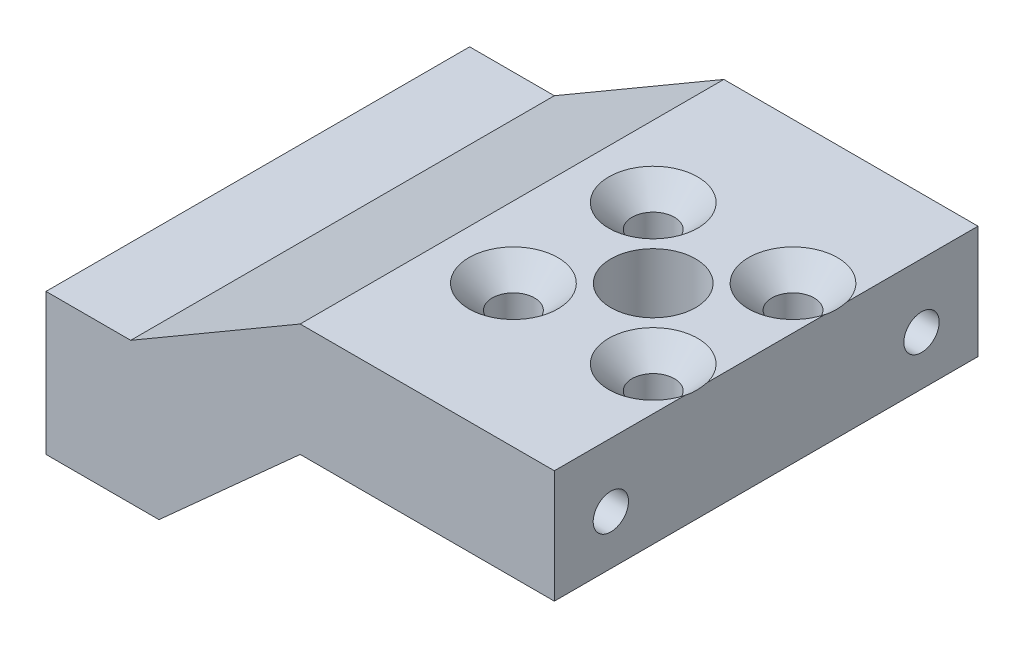
ISO-10303-21;
HEADER;
FILE_DESCRIPTION(('STEP AP214'),'2;1');
FILE_NAME('part.step','',(''),(''),'','','');
FILE_SCHEMA(('AUTOMOTIVE_DESIGN { 1 0 10303 214 1 1 1 1 }'));
ENDSEC;
DATA;
#1=APPLICATION_CONTEXT('core data for automotive mechanical design processes');
#2=APPLICATION_PROTOCOL_DEFINITION('international standard','automotive_design',2000,#1);
#3=PRODUCT_CONTEXT('',#1,'mechanical');
#4=PRODUCT('Part','Part','',(#3));
#5=PRODUCT_RELATED_PRODUCT_CATEGORY('part','',(#4));
#6=PRODUCT_DEFINITION_FORMATION('','',#4);
#7=PRODUCT_DEFINITION_CONTEXT('part definition',#1,'design');
#8=PRODUCT_DEFINITION('design','',#6,#7);
#9=PRODUCT_DEFINITION_SHAPE('','',#8);
#10=(LENGTH_UNIT() NAMED_UNIT(*) SI_UNIT(.MILLI.,.METRE.));
#11=(NAMED_UNIT(*) PLANE_ANGLE_UNIT() SI_UNIT($,.RADIAN.));
#12=(NAMED_UNIT(*) SI_UNIT($,.STERADIAN.) SOLID_ANGLE_UNIT());
#13=UNCERTAINTY_MEASURE_WITH_UNIT(LENGTH_MEASURE(1.E-05),#10,'distance_accuracy_value','');
#14=(GEOMETRIC_REPRESENTATION_CONTEXT(3) GLOBAL_UNCERTAINTY_ASSIGNED_CONTEXT((#13)) GLOBAL_UNIT_ASSIGNED_CONTEXT((#10,
#11,#12)) REPRESENTATION_CONTEXT('',''));
#15=CARTESIAN_POINT('',(0.,0.,0.));
#16=DIRECTION('',(0.,0.,1.));
#17=DIRECTION('',(1.,0.,0.));
#18=AXIS2_PLACEMENT_3D('',#15,#16,#17);
#19=CARTESIAN_POINT('',(0.,10.,0.));
#20=DIRECTION('',(0.,0.,-1.));
#21=DIRECTION('',(-1.,0.,0.));
#22=AXIS2_PLACEMENT_3D('',#19,#20,#21);
#23=PLANE('',#22);
#24=DIRECTION('',(-1.,0.,0.));
#25=VECTOR('',#24,1.);
#26=CARTESIAN_POINT('',(41.,9.,0.));
#27=LINE('',#26,#25);
#28=CARTESIAN_POINT('',(39.,9.,0.));
#29=VERTEX_POINT('',#28);
#30=CARTESIAN_POINT('',(21.,9.,0.));
#31=VERTEX_POINT('',#30);
#32=EDGE_CURVE('E143',#29,#31,#27,.T.);
#33=ORIENTED_EDGE('',*,*,#32,.F.);
#34=DIRECTION('',(0.,-1.,0.));
#35=VECTOR('',#34,1.);
#36=CARTESIAN_POINT('',(39.,17.,0.));
#37=LINE('',#36,#35);
#38=CARTESIAN_POINT('',(39.,17.,0.));
#39=VERTEX_POINT('',#38);
#40=EDGE_CURVE('E131',#39,#29,#37,.T.);
#41=ORIENTED_EDGE('',*,*,#40,.F.);
#42=DIRECTION('',(1.,0.,0.));
#43=VECTOR('',#42,1.);
#44=CARTESIAN_POINT('',(39.,17.,0.));
#45=LINE('',#44,#43);
#46=CARTESIAN_POINT('',(21.,17.,0.));
#47=VERTEX_POINT('',#46);
#48=EDGE_CURVE('E151',#47,#39,#45,.T.);
#49=ORIENTED_EDGE('',*,*,#48,.F.);
#50=DIRECTION('',(0.863778900898433,0.503871025524086,0.));
#51=VECTOR('',#50,1.);
#52=CARTESIAN_POINT('',(21.,17.,0.));
#53=LINE('',#52,#51);
#54=CARTESIAN_POINT('',(9.,10.,0.));
#55=VERTEX_POINT('',#54);
#56=EDGE_CURVE('E148',#55,#47,#53,.T.);
#57=ORIENTED_EDGE('',*,*,#56,.F.);
#58=DIRECTION('',(1.,0.,0.));
#59=VECTOR('',#58,1.);
#60=CARTESIAN_POINT('',(0.,10.,0.));
#61=LINE('',#60,#59);
#62=CARTESIAN_POINT('',(3.,10.,0.));
#63=VERTEX_POINT('',#62);
#64=EDGE_CURVE('E189',#63,#55,#61,.T.);
#65=ORIENTED_EDGE('',*,*,#64,.F.);
#66=DIRECTION('',(0.,1.,0.));
#67=VECTOR('',#66,1.);
#68=CARTESIAN_POINT('',(3.,10.,0.));
#69=LINE('',#68,#67);
#70=CARTESIAN_POINT('',(3.,0.,0.));
#71=VERTEX_POINT('',#70);
#72=EDGE_CURVE('E183',#71,#63,#69,.T.);
#73=ORIENTED_EDGE('',*,*,#72,.F.);
#74=DIRECTION('',(1.,0.,0.));
#75=VECTOR('',#74,1.);
#76=CARTESIAN_POINT('',(0.,0.,0.));
#77=LINE('',#76,#75);
#78=CARTESIAN_POINT('',(11.,0.,0.));
#79=VERTEX_POINT('',#78);
#80=EDGE_CURVE('E188',#71,#79,#77,.T.);
#81=ORIENTED_EDGE('',*,*,#80,.T.);
#82=DIRECTION('',(0.743294146247166,0.66896473162245,0.));
#83=VECTOR('',#82,1.);
#84=CARTESIAN_POINT('',(11.,0.,0.));
#85=LINE('',#84,#83);
#86=EDGE_CURVE('E305',#79,#31,#85,.T.);
#87=ORIENTED_EDGE('',*,*,#86,.T.);
#88=EDGE_LOOP('',(#33,#41,#49,#57,#65,#73,#81,#87));
#89=FACE_BOUND('',#88,.T.);
#90=ADVANCED_FACE('F36',(#89),#23,.F.);
#91=CARTESIAN_POINT('',(0.,10.,-30.));
#92=DIRECTION('',(0.,0.,1.));
#93=DIRECTION('',(1.,0.,0.));
#94=AXIS2_PLACEMENT_3D('',#91,#92,#93);
#95=PLANE('',#94);
#96=DIRECTION('',(0.,-1.,0.));
#97=VECTOR('',#96,1.);
#98=CARTESIAN_POINT('',(39.,17.,-30.));
#99=LINE('',#98,#97);
#100=CARTESIAN_POINT('',(39.,17.,-30.));
#101=VERTEX_POINT('',#100);
#102=CARTESIAN_POINT('',(39.,9.,-30.));
#103=VERTEX_POINT('',#102);
#104=EDGE_CURVE('E116',#101,#103,#99,.T.);
#105=ORIENTED_EDGE('',*,*,#104,.T.);
#106=DIRECTION('',(1.,0.,0.));
#107=VECTOR('',#106,1.);
#108=CARTESIAN_POINT('',(41.,9.,-30.));
#109=LINE('',#108,#107);
#110=CARTESIAN_POINT('',(21.,9.,-30.));
#111=VERTEX_POINT('',#110);
#112=EDGE_CURVE('E121',#111,#103,#109,.T.);
#113=ORIENTED_EDGE('',*,*,#112,.F.);
#114=DIRECTION('',(0.743294146247166,0.66896473162245,0.));
#115=VECTOR('',#114,1.);
#116=CARTESIAN_POINT('',(11.,0.,-30.));
#117=LINE('',#116,#115);
#118=CARTESIAN_POINT('',(11.,0.,-30.));
#119=VERTEX_POINT('',#118);
#120=EDGE_CURVE('E326',#119,#111,#117,.T.);
#121=ORIENTED_EDGE('',*,*,#120,.F.);
#122=DIRECTION('',(-1.,0.,0.));
#123=VECTOR('',#122,1.);
#124=CARTESIAN_POINT('',(0.,0.,-30.));
#125=LINE('',#124,#123);
#126=CARTESIAN_POINT('',(3.,0.,-30.));
#127=VERTEX_POINT('',#126);
#128=EDGE_CURVE('E192',#119,#127,#125,.T.);
#129=ORIENTED_EDGE('',*,*,#128,.T.);
#130=DIRECTION('',(0.,-1.,0.));
#131=VECTOR('',#130,1.);
#132=CARTESIAN_POINT('',(3.,10.,-30.));
#133=LINE('',#132,#131);
#134=CARTESIAN_POINT('',(3.,10.,-30.));
#135=VERTEX_POINT('',#134);
#136=EDGE_CURVE('E170',#135,#127,#133,.T.);
#137=ORIENTED_EDGE('',*,*,#136,.F.);
#138=DIRECTION('',(-1.,0.,0.));
#139=VECTOR('',#138,1.);
#140=CARTESIAN_POINT('',(0.,10.,-30.));
#141=LINE('',#140,#139);
#142=CARTESIAN_POINT('',(9.,10.,-30.));
#143=VERTEX_POINT('',#142);
#144=EDGE_CURVE('E135',#143,#135,#141,.T.);
#145=ORIENTED_EDGE('',*,*,#144,.F.);
#146=DIRECTION('',(0.863778900898433,0.503871025524086,0.));
#147=VECTOR('',#146,1.);
#148=CARTESIAN_POINT('',(21.,17.,-30.));
#149=LINE('',#148,#147);
#150=CARTESIAN_POINT('',(21.,17.,-30.));
#151=VERTEX_POINT('',#150);
#152=EDGE_CURVE('E125',#143,#151,#149,.T.);
#153=ORIENTED_EDGE('',*,*,#152,.T.);
#154=DIRECTION('',(1.,0.,0.));
#155=VECTOR('',#154,1.);
#156=CARTESIAN_POINT('',(39.,17.,-30.));
#157=LINE('',#156,#155);
#158=EDGE_CURVE('E124',#151,#101,#157,.T.);
#159=ORIENTED_EDGE('',*,*,#158,.T.);
#160=EDGE_LOOP('',(#105,#113,#121,#129,#137,#145,#153,#159));
#161=FACE_BOUND('',#160,.T.);
#162=ADVANCED_FACE('F118',(#161),#95,.F.);
#163=CARTESIAN_POINT('',(0.,10.,0.));
#164=DIRECTION('',(0.,-1.,0.));
#165=DIRECTION('',(0.,0.,-1.));
#166=AXIS2_PLACEMENT_3D('',#163,#164,#165);
#167=PLANE('',#166);
#168=ORIENTED_EDGE('',*,*,#64,.T.);
#169=DIRECTION('',(0.,0.,-1.));
#170=VECTOR('',#169,1.);
#171=CARTESIAN_POINT('',(9.,10.,0.));
#172=LINE('',#171,#170);
#173=EDGE_CURVE('E153',#55,#143,#172,.T.);
#174=ORIENTED_EDGE('',*,*,#173,.T.);
#175=ORIENTED_EDGE('',*,*,#144,.T.);
#176=DIRECTION('',(0.,0.,-1.));
#177=VECTOR('',#176,1.);
#178=CARTESIAN_POINT('',(3.,10.,-30.));
#179=LINE('',#178,#177);
#180=EDGE_CURVE('E185',#63,#135,#179,.T.);
#181=ORIENTED_EDGE('',*,*,#180,.F.);
#182=EDGE_LOOP('',(#168,#174,#175,#181));
#183=FACE_BOUND('',#182,.T.);
#184=ADVANCED_FACE('F251',(#183),#167,.F.);
#185=CARTESIAN_POINT('',(0.,0.,0.));
#186=DIRECTION('',(0.,-1.,0.));
#187=DIRECTION('',(0.,0.,-1.));
#188=AXIS2_PLACEMENT_3D('',#185,#186,#187);
#189=PLANE('',#188);
#190=DIRECTION('',(0.,0.,-1.));
#191=VECTOR('',#190,1.);
#192=CARTESIAN_POINT('',(11.,0.,0.));
#193=LINE('',#192,#191);
#194=EDGE_CURVE('E300',#79,#119,#193,.T.);
#195=ORIENTED_EDGE('',*,*,#194,.F.);
#196=ORIENTED_EDGE('',*,*,#80,.F.);
#197=DIRECTION('',(0.,0.,1.));
#198=VECTOR('',#197,1.);
#199=CARTESIAN_POINT('',(3.,0.,-30.));
#200=LINE('',#199,#198);
#201=EDGE_CURVE('E181',#127,#71,#200,.T.);
#202=ORIENTED_EDGE('',*,*,#201,.F.);
#203=ORIENTED_EDGE('',*,*,#128,.F.);
#204=EDGE_LOOP('',(#195,#196,#202,#203));
#205=FACE_BOUND('',#204,.T.);
#206=ADVANCED_FACE('F249',(#205),#189,.T.);
#207=CARTESIAN_POINT('',(3.,0.,0.));
#208=DIRECTION('',(-1.,0.,0.));
#209=DIRECTION('',(0.,0.,1.));
#210=AXIS2_PLACEMENT_3D('',#207,#208,#209);
#211=PLANE('',#210);
#212=CARTESIAN_POINT('',(3.,5.4,-10.));
#213=DIRECTION('',(-1.,0.,0.));
#214=DIRECTION('',(0.,0.,1.));
#215=AXIS2_PLACEMENT_3D('',#212,#213,#214);
#216=CIRCLE('',#215,1.25);
#217=CARTESIAN_POINT('',(3.,5.4,-8.75));
#218=VERTEX_POINT('',#217);
#219=EDGE_CURVE('E160',#218,#218,#216,.T.);
#220=ORIENTED_EDGE('',*,*,#219,.F.);
#221=EDGE_LOOP('',(#220));
#222=FACE_BOUND('',#221,.T.);
#223=CARTESIAN_POINT('',(3.,5.4,-20.));
#224=DIRECTION('',(-1.,0.,0.));
#225=DIRECTION('',(0.,0.,1.));
#226=AXIS2_PLACEMENT_3D('',#223,#224,#225);
#227=CIRCLE('',#226,1.25);
#228=CARTESIAN_POINT('',(3.,5.4,-18.75));
#229=VERTEX_POINT('',#228);
#230=EDGE_CURVE('E171',#229,#229,#227,.T.);
#231=ORIENTED_EDGE('',*,*,#230,.F.);
#232=EDGE_LOOP('',(#231));
#233=FACE_BOUND('',#232,.T.);
#234=ORIENTED_EDGE('',*,*,#136,.T.);
#235=ORIENTED_EDGE('',*,*,#201,.T.);
#236=ORIENTED_EDGE('',*,*,#72,.T.);
#237=ORIENTED_EDGE('',*,*,#180,.T.);
#238=EDGE_LOOP('',(#234,#235,#236,#237));
#239=FACE_BOUND('',#238,.T.);
#240=ADVANCED_FACE('F239',(#222,#233,#239),#211,.T.);
#241=CARTESIAN_POINT('',(8.,5.4,-20.));
#242=DIRECTION('',(-1.,0.,0.));
#243=DIRECTION('',(0.,0.,1.));
#244=AXIS2_PLACEMENT_3D('',#241,#242,#243);
#245=CYLINDRICAL_SURFACE('',#244,1.25);
#246=CARTESIAN_POINT('',(8.,5.4,-20.));
#247=DIRECTION('',(-1.,0.,0.));
#248=DIRECTION('',(0.,0.,1.));
#249=AXIS2_PLACEMENT_3D('',#246,#247,#248);
#250=CIRCLE('',#249,1.25);
#251=CARTESIAN_POINT('',(8.,5.4,-18.75));
#252=VERTEX_POINT('',#251);
#253=EDGE_CURVE('E167',#252,#252,#250,.T.);
#254=ORIENTED_EDGE('',*,*,#253,.F.);
#255=EDGE_LOOP('',(#254));
#256=FACE_BOUND('',#255,.T.);
#257=ORIENTED_EDGE('',*,*,#230,.T.);
#258=EDGE_LOOP('',(#257));
#259=FACE_BOUND('',#258,.T.);
#260=ADVANCED_FACE('F235',(#256,#259),#245,.F.);
#261=CARTESIAN_POINT('',(8.,5.4,-20.));
#262=DIRECTION('',(-1.,0.,0.));
#263=DIRECTION('',(0.,0.,1.));
#264=AXIS2_PLACEMENT_3D('',#261,#262,#263);
#265=PLANE('',#264);
#266=ORIENTED_EDGE('',*,*,#253,.T.);
#267=EDGE_LOOP('',(#266));
#268=FACE_BOUND('',#267,.T.);
#269=ADVANCED_FACE('F230',(#268),#265,.T.);
#270=CARTESIAN_POINT('',(8.,5.4,-10.));
#271=DIRECTION('',(-1.,0.,0.));
#272=DIRECTION('',(0.,0.,1.));
#273=AXIS2_PLACEMENT_3D('',#270,#271,#272);
#274=CYLINDRICAL_SURFACE('',#273,1.25);
#275=CARTESIAN_POINT('',(8.,5.4,-10.));
#276=DIRECTION('',(-1.,0.,0.));
#277=DIRECTION('',(0.,0.,1.));
#278=AXIS2_PLACEMENT_3D('',#275,#276,#277);
#279=CIRCLE('',#278,1.25);
#280=CARTESIAN_POINT('',(8.,5.4,-8.75));
#281=VERTEX_POINT('',#280);
#282=EDGE_CURVE('E174',#281,#281,#279,.T.);
#283=ORIENTED_EDGE('',*,*,#282,.F.);
#284=EDGE_LOOP('',(#283));
#285=FACE_BOUND('',#284,.T.);
#286=ORIENTED_EDGE('',*,*,#219,.T.);
#287=EDGE_LOOP('',(#286));
#288=FACE_BOUND('',#287,.T.);
#289=ADVANCED_FACE('F234',(#285,#288),#274,.F.);
#290=CARTESIAN_POINT('',(8.,5.4,-10.));
#291=DIRECTION('',(-1.,0.,0.));
#292=DIRECTION('',(0.,0.,1.));
#293=AXIS2_PLACEMENT_3D('',#290,#291,#292);
#294=PLANE('',#293);
#295=ORIENTED_EDGE('',*,*,#282,.T.);
#296=EDGE_LOOP('',(#295));
#297=FACE_BOUND('',#296,.T.);
#298=ADVANCED_FACE('F226',(#297),#294,.T.);
#299=CARTESIAN_POINT('',(39.,17.,0.));
#300=DIRECTION('',(1.,0.,0.));
#301=DIRECTION('',(0.,0.,-1.));
#302=AXIS2_PLACEMENT_3D('',#299,#300,#301);
#303=PLANE('',#302);
#304=CARTESIAN_POINT('',(39.,12.5,-26.));
#305=DIRECTION('',(1.,0.,0.));
#306=DIRECTION('',(0.,0.,-1.));
#307=AXIS2_PLACEMENT_3D('',#304,#305,#306);
#308=CIRCLE('',#307,1.25);
#309=CARTESIAN_POINT('',(39.,12.5,-27.25));
#310=VERTEX_POINT('',#309);
#311=EDGE_CURVE('E312',#310,#310,#308,.T.);
#312=ORIENTED_EDGE('',*,*,#311,.F.);
#313=EDGE_LOOP('',(#312));
#314=FACE_BOUND('',#313,.T.);
#315=CARTESIAN_POINT('',(39.,12.5,-4.));
#316=DIRECTION('',(1.,0.,0.));
#317=DIRECTION('',(0.,0.,-1.));
#318=AXIS2_PLACEMENT_3D('',#315,#316,#317);
#319=CIRCLE('',#318,1.25);
#320=CARTESIAN_POINT('',(39.,12.5,-5.25));
#321=VERTEX_POINT('',#320);
#322=EDGE_CURVE('E316',#321,#321,#319,.T.);
#323=ORIENTED_EDGE('',*,*,#322,.F.);
#324=EDGE_LOOP('',(#323));
#325=FACE_BOUND('',#324,.T.);
#326=DIRECTION('',(0.,0.,-1.));
#327=VECTOR('',#326,1.);
#328=CARTESIAN_POINT('',(39.,17.,0.));
#329=LINE('',#328,#327);
#330=CARTESIAN_POINT('',(39.,17.,-20.736169424315));
#331=VERTEX_POINT('',#330);
#332=EDGE_CURVE('E162',#331,#101,#329,.T.);
#333=ORIENTED_EDGE('',*,*,#332,.F.);
#334=CARTESIAN_POINT('',(39.,17.,-20.736169424315));
#335=CARTESIAN_POINT('',(39.,16.9809347089593,-20.6599129751691));
#336=CARTESIAN_POINT('',(39.,16.9643557078154,-20.5830043603521));
#337=CARTESIAN_POINT('',(39.,16.9366109564894,-20.4281674595546));
#338=CARTESIAN_POINT('',(39.,16.9254488881659,-20.3502385169082));
#339=CARTESIAN_POINT('',(39.,16.9091564237654,-20.1951837275954));
#340=CARTESIAN_POINT('',(39.,16.9039192564694,-20.1180693291967));
#341=CARTESIAN_POINT('',(39.,16.8993084883661,-19.9637080099177));
#342=CARTESIAN_POINT('',(39.,16.8999322274083,-19.8864611650685));
#343=CARTESIAN_POINT('',(39.,16.9084641878528,-19.701119507488));
#344=CARTESIAN_POINT('',(39.,16.9192071766616,-19.5931405008372));
#345=CARTESIAN_POINT('',(39.,16.9434559904952,-19.431742660224));
#346=CARTESIAN_POINT('',(39.,16.9529853287547,-19.3776828198417));
#347=CARTESIAN_POINT('',(39.,16.9746116073862,-19.270092670411));
#348=CARTESIAN_POINT('',(39.,16.9867078717128,-19.2165622258144));
#349=CARTESIAN_POINT('',(39.,17.,-19.1633255122967));
#350=B_SPLINE_CURVE_WITH_KNOTS('',3,(#334,#335,#336,#337,#338,#339,#340,#341,#342,#343,#344,
#345,#346,#347,#348,#349),.UNSPECIFIED.,.F.,.F.,(4,2,2,2,2,2,2,4),(0.,0.235813654519414,
0.471787366541151,0.70343731730826,0.934982131783222,1.25985390950212,1.42448277290965,
1.58906833207601),.UNSPECIFIED.);
#351=CARTESIAN_POINT('',(39.,17.,-19.1633255122967));
#352=VERTEX_POINT('',#351);
#353=EDGE_CURVE('E52',#331,#352,#350,.T.);
#354=ORIENTED_EDGE('',*,*,#353,.T.);
#355=CARTESIAN_POINT('',(39.,17.,-10.8366744877036));
#356=VERTEX_POINT('',#355);
#357=EDGE_CURVE('E161',#356,#352,#329,.T.);
#358=ORIENTED_EDGE('',*,*,#357,.F.);
#359=CARTESIAN_POINT('',(39.,17.,-10.8366744877036));
#360=CARTESIAN_POINT('',(39.,16.9809347089593,-10.7604180385577));
#361=CARTESIAN_POINT('',(39.,16.9643557078154,-10.6835094237407));
#362=CARTESIAN_POINT('',(39.,16.9366109564894,-10.5286725229432));
#363=CARTESIAN_POINT('',(39.,16.9254488881658,-10.4507435802968));
#364=CARTESIAN_POINT('',(39.,16.9091564237654,-10.295688790984));
#365=CARTESIAN_POINT('',(39.,16.9039192564694,-10.2185743925853));
#366=CARTESIAN_POINT('',(39.,16.899308488366,-10.0642130733064));
#367=CARTESIAN_POINT('',(39.,16.8999322274082,-9.98696622845716));
#368=CARTESIAN_POINT('',(39.,16.9084641878527,-9.80162457087648));
#369=CARTESIAN_POINT('',(39.,16.9192071766615,-9.69364556422564));
#370=CARTESIAN_POINT('',(39.,16.9434559904951,-9.53224772361223));
#371=CARTESIAN_POINT('',(39.,16.9529853287546,-9.47818788322983));
#372=CARTESIAN_POINT('',(39.,16.9746116073862,-9.37059773379905));
#373=CARTESIAN_POINT('',(39.,16.9867078717128,-9.31706728920235));
#374=CARTESIAN_POINT('',(39.,17.,-9.26383057568458));
#375=B_SPLINE_CURVE_WITH_KNOTS('',3,(#359,#360,#361,#362,#363,#364,#365,#366,#367,#368,#369,
#370,#371,#372,#373,#374),.UNSPECIFIED.,.F.,.F.,(4,2,2,2,2,2,2,4),(0.,0.235813654519414,
0.47178736654115,0.703437317308257,0.934982131783214,1.25985390950247,1.42448277291018,
1.58906833207673),.UNSPECIFIED.);
#376=CARTESIAN_POINT('',(39.,17.,-9.26383057568458));
#377=VERTEX_POINT('',#376);
#378=EDGE_CURVE('E210',#356,#377,#375,.T.);
#379=ORIENTED_EDGE('',*,*,#378,.T.);
#380=EDGE_CURVE('E157',#39,#377,#329,.T.);
#381=ORIENTED_EDGE('',*,*,#380,.F.);
#382=ORIENTED_EDGE('',*,*,#40,.T.);
#383=DIRECTION('',(0.,0.,-1.));
#384=VECTOR('',#383,1.);
#385=CARTESIAN_POINT('',(39.,9.,0.));
#386=LINE('',#385,#384);
#387=EDGE_CURVE('E128',#29,#103,#386,.T.);
#388=ORIENTED_EDGE('',*,*,#387,.T.);
#389=ORIENTED_EDGE('',*,*,#104,.F.);
#390=EDGE_LOOP('',(#333,#354,#358,#379,#381,#382,#388,#389));
#391=FACE_BOUND('',#390,.T.);
#392=ADVANCED_FACE('F129',(#314,#325,#391),#303,.T.);
#393=CARTESIAN_POINT('',(39.,17.,0.));
#394=DIRECTION('',(0.,1.,0.));
#395=DIRECTION('',(0.,0.,1.));
#396=AXIS2_PLACEMENT_3D('',#393,#394,#395);
#397=PLANE('',#396);
#398=CARTESIAN_POINT('',(30.9999999999999,17.,-14.9999999999999));
#399=DIRECTION('',(0.,1.,0.));
#400=DIRECTION('',(0.,0.,1.));
#401=AXIS2_PLACEMENT_3D('',#398,#399,#400);
#402=CIRCLE('',#401,2.99999999999999);
#403=CARTESIAN_POINT('',(30.9999999999999,17.,-11.9999999999999));
#404=VERTEX_POINT('',#403);
#405=EDGE_CURVE('E332',#404,#404,#402,.T.);
#406=ORIENTED_EDGE('',*,*,#405,.F.);
#407=EDGE_LOOP('',(#406));
#408=FACE_BOUND('',#407,.T.);
#409=CARTESIAN_POINT('',(26.0502525316941,17.,-19.9497474683058));
#410=DIRECTION('',(0.,1.,0.));
#411=DIRECTION('',(0.,0.,1.));
#412=AXIS2_PLACEMENT_3D('',#409,#410,#411);
#413=CIRCLE('',#412,3.14999999999999);
#414=CARTESIAN_POINT('',(26.0502525316941,17.,-16.7997474683058));
#415=VERTEX_POINT('',#414);
#416=EDGE_CURVE('E205',#415,#415,#413,.F.);
#417=ORIENTED_EDGE('',*,*,#416,.T.);
#418=EDGE_LOOP('',(#417));
#419=FACE_BOUND('',#418,.T.);
#420=CARTESIAN_POINT('',(26.0502525316942,17.,-10.050252531694));
#421=DIRECTION('',(0.,1.,0.));
#422=DIRECTION('',(0.,0.,1.));
#423=AXIS2_PLACEMENT_3D('',#420,#421,#422);
#424=CIRCLE('',#423,3.15000000000001);
#425=CARTESIAN_POINT('',(26.0502525316942,17.,-6.90025253169399));
#426=VERTEX_POINT('',#425);
#427=EDGE_CURVE('E202',#426,#426,#424,.F.);
#428=ORIENTED_EDGE('',*,*,#427,.T.);
#429=EDGE_LOOP('',(#428));
#430=FACE_BOUND('',#429,.T.);
#431=ORIENTED_EDGE('',*,*,#357,.T.);
#432=CARTESIAN_POINT('',(35.9497474683058,17.,-19.9497474683058));
#433=DIRECTION('',(0.,1.,0.));
#434=DIRECTION('',(0.,0.,1.));
#435=AXIS2_PLACEMENT_3D('',#432,#433,#434);
#436=CIRCLE('',#435,3.15000000000001);
#437=EDGE_CURVE('E208',#352,#331,#436,.F.);
#438=ORIENTED_EDGE('',*,*,#437,.T.);
#439=ORIENTED_EDGE('',*,*,#332,.T.);
#440=ORIENTED_EDGE('',*,*,#158,.F.);
#441=DIRECTION('',(0.,0.,-1.));
#442=VECTOR('',#441,1.);
#443=CARTESIAN_POINT('',(21.,17.,0.));
#444=LINE('',#443,#442);
#445=EDGE_CURVE('E163',#47,#151,#444,.T.);
#446=ORIENTED_EDGE('',*,*,#445,.F.);
#447=ORIENTED_EDGE('',*,*,#48,.T.);
#448=ORIENTED_EDGE('',*,*,#380,.T.);
#449=CARTESIAN_POINT('',(35.9497474683059,17.,-10.0502525316941));
#450=DIRECTION('',(0.,1.,0.));
#451=DIRECTION('',(0.,0.,1.));
#452=AXIS2_PLACEMENT_3D('',#449,#450,#451);
#453=CIRCLE('',#452,3.15000000000001);
#454=EDGE_CURVE('E199',#377,#356,#453,.F.);
#455=ORIENTED_EDGE('',*,*,#454,.T.);
#456=EDGE_LOOP('',(#431,#438,#439,#440,#446,#447,#448,#455));
#457=FACE_BOUND('',#456,.T.);
#458=ADVANCED_FACE('F225',(#408,#419,#430,#457),#397,.T.);
#459=CARTESIAN_POINT('',(21.,17.,0.));
#460=DIRECTION('',(-0.503871025524086,0.863778900898433,0.));
#461=DIRECTION('',(-0.863778900898434,-0.503871025524086,0.));
#462=AXIS2_PLACEMENT_3D('',#459,#460,#461);
#463=PLANE('',#462);
#464=ORIENTED_EDGE('',*,*,#152,.F.);
#465=ORIENTED_EDGE('',*,*,#173,.F.);
#466=ORIENTED_EDGE('',*,*,#56,.T.);
#467=ORIENTED_EDGE('',*,*,#445,.T.);
#468=EDGE_LOOP('',(#464,#465,#466,#467));
#469=FACE_BOUND('',#468,.T.);
#470=ADVANCED_FACE('F228',(#469),#463,.T.);
#471=CARTESIAN_POINT('',(0.,9.,0.));
#472=DIRECTION('',(0.,-1.,0.));
#473=DIRECTION('',(0.,0.,-1.));
#474=AXIS2_PLACEMENT_3D('',#471,#472,#473);
#475=PLANE('',#474);
#476=CARTESIAN_POINT('',(30.9999999999999,9.,-14.9999999999999));
#477=DIRECTION('',(0.,-1.,0.));
#478=DIRECTION('',(0.,0.,-1.));
#479=AXIS2_PLACEMENT_3D('',#476,#477,#478);
#480=CIRCLE('',#479,2.99999999999999);
#481=CARTESIAN_POINT('',(30.9999999999999,9.,-17.9999999999999));
#482=VERTEX_POINT('',#481);
#483=EDGE_CURVE('E41',#482,#482,#480,.T.);
#484=ORIENTED_EDGE('',*,*,#483,.F.);
#485=EDGE_LOOP('',(#484));
#486=FACE_BOUND('',#485,.T.);
#487=ORIENTED_EDGE('',*,*,#387,.F.);
#488=ORIENTED_EDGE('',*,*,#32,.T.);
#489=DIRECTION('',(0.,0.,-1.));
#490=VECTOR('',#489,1.);
#491=CARTESIAN_POINT('',(21.,9.,-30.));
#492=LINE('',#491,#490);
#493=EDGE_CURVE('E141',#31,#111,#492,.T.);
#494=ORIENTED_EDGE('',*,*,#493,.T.);
#495=ORIENTED_EDGE('',*,*,#112,.T.);
#496=EDGE_LOOP('',(#487,#488,#494,#495));
#497=FACE_BOUND('',#496,.T.);
#498=CARTESIAN_POINT('',(35.9497474683059,9.,-10.0502525316941));
#499=DIRECTION('',(0.,1.,0.));
#500=DIRECTION('',(0.,0.,1.));
#501=AXIS2_PLACEMENT_3D('',#498,#499,#500);
#502=CIRCLE('',#501,1.5);
#503=CARTESIAN_POINT('',(35.9497474683059,9.,-8.55025253169411));
#504=VERTEX_POINT('',#503);
#505=EDGE_CURVE('E303',#504,#504,#502,.T.);
#506=ORIENTED_EDGE('',*,*,#505,.T.);
#507=EDGE_LOOP('',(#506));
#508=FACE_BOUND('',#507,.T.);
#509=CARTESIAN_POINT('',(26.0502525316942,9.,-10.050252531694));
#510=DIRECTION('',(0.,1.,0.));
#511=DIRECTION('',(0.,0.,1.));
#512=AXIS2_PLACEMENT_3D('',#509,#510,#511);
#513=CIRCLE('',#512,1.5);
#514=CARTESIAN_POINT('',(26.0502525316942,9.,-8.550252531694));
#515=VERTEX_POINT('',#514);
#516=EDGE_CURVE('E299',#515,#515,#513,.T.);
#517=ORIENTED_EDGE('',*,*,#516,.T.);
#518=EDGE_LOOP('',(#517));
#519=FACE_BOUND('',#518,.T.);
#520=CARTESIAN_POINT('',(26.0502525316941,9.,-19.9497474683058));
#521=DIRECTION('',(0.,1.,0.));
#522=DIRECTION('',(0.,0.,1.));
#523=AXIS2_PLACEMENT_3D('',#520,#521,#522);
#524=CIRCLE('',#523,1.49999999999996);
#525=CARTESIAN_POINT('',(26.0502525316941,9.,-18.4497474683058));
#526=VERTEX_POINT('',#525);
#527=EDGE_CURVE('E297',#526,#526,#524,.T.);
#528=ORIENTED_EDGE('',*,*,#527,.T.);
#529=EDGE_LOOP('',(#528));
#530=FACE_BOUND('',#529,.T.);
#531=CARTESIAN_POINT('',(35.9497474683058,9.,-19.9497474683058));
#532=DIRECTION('',(0.,1.,0.));
#533=DIRECTION('',(0.,0.,1.));
#534=AXIS2_PLACEMENT_3D('',#531,#532,#533);
#535=CIRCLE('',#534,1.5);
#536=CARTESIAN_POINT('',(35.9497474683058,9.,-18.4497474683058));
#537=VERTEX_POINT('',#536);
#538=EDGE_CURVE('E309',#537,#537,#535,.T.);
#539=ORIENTED_EDGE('',*,*,#538,.T.);
#540=EDGE_LOOP('',(#539));
#541=FACE_BOUND('',#540,.T.);
#542=ADVANCED_FACE('F138',(#486,#497,#508,#519,#530,#541),#475,.T.);
#543=CARTESIAN_POINT('',(34.5,12.5,-4.));
#544=DIRECTION('',(1.,0.,0.));
#545=DIRECTION('',(0.,0.,-1.));
#546=AXIS2_PLACEMENT_3D('',#543,#544,#545);
#547=CYLINDRICAL_SURFACE('',#546,1.25);
#548=CARTESIAN_POINT('',(34.5,12.5,-4.));
#549=DIRECTION('',(1.,0.,0.));
#550=DIRECTION('',(0.,0.,-1.));
#551=AXIS2_PLACEMENT_3D('',#548,#549,#550);
#552=CIRCLE('',#551,1.25);
#553=CARTESIAN_POINT('',(34.5,12.5,-5.25));
#554=VERTEX_POINT('',#553);
#555=EDGE_CURVE('E319',#554,#554,#552,.T.);
#556=ORIENTED_EDGE('',*,*,#555,.F.);
#557=EDGE_LOOP('',(#556));
#558=FACE_BOUND('',#557,.T.);
#559=ORIENTED_EDGE('',*,*,#322,.T.);
#560=EDGE_LOOP('',(#559));
#561=FACE_BOUND('',#560,.T.);
#562=ADVANCED_FACE('F363',(#558,#561),#547,.F.);
#563=CARTESIAN_POINT('',(34.5,12.5,-4.));
#564=DIRECTION('',(1.,0.,0.));
#565=DIRECTION('',(0.,0.,-1.));
#566=AXIS2_PLACEMENT_3D('',#563,#564,#565);
#567=PLANE('',#566);
#568=ORIENTED_EDGE('',*,*,#555,.T.);
#569=EDGE_LOOP('',(#568));
#570=FACE_BOUND('',#569,.T.);
#571=ADVANCED_FACE('F359',(#570),#567,.T.);
#572=CARTESIAN_POINT('',(34.5,12.5,-26.));
#573=DIRECTION('',(1.,0.,0.));
#574=DIRECTION('',(0.,0.,-1.));
#575=AXIS2_PLACEMENT_3D('',#572,#573,#574);
#576=CYLINDRICAL_SURFACE('',#575,1.25);
#577=CARTESIAN_POINT('',(34.5,12.5,-26.));
#578=DIRECTION('',(1.,0.,0.));
#579=DIRECTION('',(0.,0.,-1.));
#580=AXIS2_PLACEMENT_3D('',#577,#578,#579);
#581=CIRCLE('',#580,1.25);
#582=CARTESIAN_POINT('',(34.5,12.5,-27.25));
#583=VERTEX_POINT('',#582);
#584=EDGE_CURVE('E313',#583,#583,#581,.T.);
#585=ORIENTED_EDGE('',*,*,#584,.F.);
#586=EDGE_LOOP('',(#585));
#587=FACE_BOUND('',#586,.T.);
#588=ORIENTED_EDGE('',*,*,#311,.T.);
#589=EDGE_LOOP('',(#588));
#590=FACE_BOUND('',#589,.T.);
#591=ADVANCED_FACE('F355',(#587,#590),#576,.F.);
#592=CARTESIAN_POINT('',(34.5,12.5,-26.));
#593=DIRECTION('',(1.,0.,0.));
#594=DIRECTION('',(0.,0.,-1.));
#595=AXIS2_PLACEMENT_3D('',#592,#593,#594);
#596=PLANE('',#595);
#597=ORIENTED_EDGE('',*,*,#584,.T.);
#598=EDGE_LOOP('',(#597));
#599=FACE_BOUND('',#598,.T.);
#600=ADVANCED_FACE('F351',(#599),#596,.T.);
#601=CARTESIAN_POINT('',(35.9497474683058,17.,-19.9497474683058));
#602=DIRECTION('',(0.,-1.,0.));
#603=DIRECTION('',(0.,0.,-1.));
#604=AXIS2_PLACEMENT_3D('',#601,#602,#603);
#605=CYLINDRICAL_SURFACE('',#604,1.5);
#606=CARTESIAN_POINT('',(35.9497474683058,15.35,-19.9497474683058));
#607=DIRECTION('',(0.,1.,0.));
#608=DIRECTION('',(0.,0.,1.));
#609=AXIS2_PLACEMENT_3D('',#606,#607,#608);
#610=CIRCLE('',#609,1.5);
#611=CARTESIAN_POINT('',(35.9497474683058,15.35,-18.4497474683058));
#612=VERTEX_POINT('',#611);
#613=EDGE_CURVE('E134',#612,#612,#610,.T.);
#614=ORIENTED_EDGE('',*,*,#613,.T.);
#615=EDGE_LOOP('',(#614));
#616=FACE_BOUND('',#615,.T.);
#617=ORIENTED_EDGE('',*,*,#538,.F.);
#618=EDGE_LOOP('',(#617));
#619=FACE_BOUND('',#618,.T.);
#620=ADVANCED_FACE('F293',(#616,#619),#605,.F.);
#621=CARTESIAN_POINT('',(26.0502525316941,17.,-19.9497474683058));
#622=DIRECTION('',(0.,-1.,0.));
#623=DIRECTION('',(0.,0.,-1.));
#624=AXIS2_PLACEMENT_3D('',#621,#622,#623);
#625=CYLINDRICAL_SURFACE('',#624,1.49999999999996);
#626=CARTESIAN_POINT('',(26.0502525316941,15.35,-19.9497474683058));
#627=DIRECTION('',(0.,1.,0.));
#628=DIRECTION('',(0.,0.,1.));
#629=AXIS2_PLACEMENT_3D('',#626,#627,#628);
#630=CIRCLE('',#629,1.49999999999996);
#631=CARTESIAN_POINT('',(26.0502525316941,15.35,-18.4497474683058));
#632=VERTEX_POINT('',#631);
#633=EDGE_CURVE('E283',#632,#632,#630,.T.);
#634=ORIENTED_EDGE('',*,*,#633,.T.);
#635=EDGE_LOOP('',(#634));
#636=FACE_BOUND('',#635,.T.);
#637=ORIENTED_EDGE('',*,*,#527,.F.);
#638=EDGE_LOOP('',(#637));
#639=FACE_BOUND('',#638,.T.);
#640=ADVANCED_FACE('F288',(#636,#639),#625,.F.);
#641=CARTESIAN_POINT('',(26.0502525316942,17.,-10.050252531694));
#642=DIRECTION('',(0.,-1.,0.));
#643=DIRECTION('',(0.,0.,-1.));
#644=AXIS2_PLACEMENT_3D('',#641,#642,#643);
#645=CYLINDRICAL_SURFACE('',#644,1.5);
#646=CARTESIAN_POINT('',(26.0502525316942,15.35,-10.050252531694));
#647=DIRECTION('',(0.,1.,0.));
#648=DIRECTION('',(0.,0.,1.));
#649=AXIS2_PLACEMENT_3D('',#646,#647,#648);
#650=CIRCLE('',#649,1.5);
#651=CARTESIAN_POINT('',(26.0502525316942,15.35,-8.550252531694));
#652=VERTEX_POINT('',#651);
#653=EDGE_CURVE('E46',#652,#652,#650,.T.);
#654=ORIENTED_EDGE('',*,*,#653,.T.);
#655=EDGE_LOOP('',(#654));
#656=FACE_BOUND('',#655,.T.);
#657=ORIENTED_EDGE('',*,*,#516,.F.);
#658=EDGE_LOOP('',(#657));
#659=FACE_BOUND('',#658,.T.);
#660=ADVANCED_FACE('F292',(#656,#659),#645,.F.);
#661=CARTESIAN_POINT('',(35.9497474683059,17.,-10.0502525316941));
#662=DIRECTION('',(0.,-1.,0.));
#663=DIRECTION('',(0.,0.,-1.));
#664=AXIS2_PLACEMENT_3D('',#661,#662,#663);
#665=CYLINDRICAL_SURFACE('',#664,1.5);
#666=CARTESIAN_POINT('',(35.9497474683059,15.35,-10.0502525316941));
#667=DIRECTION('',(0.,1.,0.));
#668=DIRECTION('',(0.,0.,1.));
#669=AXIS2_PLACEMENT_3D('',#666,#667,#668);
#670=CIRCLE('',#669,1.5);
#671=CARTESIAN_POINT('',(35.9497474683059,15.35,-8.55025253169411));
#672=VERTEX_POINT('',#671);
#673=EDGE_CURVE('E11',#672,#672,#670,.T.);
#674=ORIENTED_EDGE('',*,*,#673,.T.);
#675=EDGE_LOOP('',(#674));
#676=FACE_BOUND('',#675,.T.);
#677=ORIENTED_EDGE('',*,*,#505,.F.);
#678=EDGE_LOOP('',(#677));
#679=FACE_BOUND('',#678,.T.);
#680=ADVANCED_FACE('F337',(#676,#679),#665,.F.);
#681=CARTESIAN_POINT('',(11.,0.,0.));
#682=DIRECTION('',(-0.66896473162245,0.743294146247166,0.));
#683=DIRECTION('',(-0.743294146247166,-0.66896473162245,0.));
#684=AXIS2_PLACEMENT_3D('',#681,#682,#683);
#685=PLANE('',#684);
#686=ORIENTED_EDGE('',*,*,#120,.T.);
#687=ORIENTED_EDGE('',*,*,#493,.F.);
#688=ORIENTED_EDGE('',*,*,#86,.F.);
#689=ORIENTED_EDGE('',*,*,#194,.T.);
#690=EDGE_LOOP('',(#686,#687,#688,#689));
#691=FACE_BOUND('',#690,.T.);
#692=ADVANCED_FACE('F267',(#691),#685,.F.);
#693=CARTESIAN_POINT('',(35.9497474683058,15.35,-19.9497474683058));
#694=DIRECTION('',(0.,1.,0.));
#695=DIRECTION('',(0.,0.,1.));
#696=AXIS2_PLACEMENT_3D('',#693,#694,#695);
#697=CONICAL_SURFACE('',#696,1.5,0.78539816339745);
#698=ORIENTED_EDGE('',*,*,#353,.F.);
#699=ORIENTED_EDGE('',*,*,#437,.F.);
#700=EDGE_LOOP('',(#698,#699));
#701=FACE_BOUND('',#700,.T.);
#702=ORIENTED_EDGE('',*,*,#613,.F.);
#703=EDGE_LOOP('',(#702));
#704=FACE_BOUND('',#703,.T.);
#705=ADVANCED_FACE('F262',(#701,#704),#697,.F.);
#706=CARTESIAN_POINT('',(26.0502525316941,15.35,-19.9497474683058));
#707=DIRECTION('',(0.,1.,0.));
#708=DIRECTION('',(0.,0.,1.));
#709=AXIS2_PLACEMENT_3D('',#706,#707,#708);
#710=CONICAL_SURFACE('',#709,1.49999999999996,0.785398163397452);
#711=CARTESIAN_POINT('',(26.0502525316941,17.,-16.7997474683058));
#712=CARTESIAN_POINT('',(26.0502525316941,16.9828125,-16.8169349683058));
#713=CARTESIAN_POINT('',(26.0502525316941,16.965625,-16.8341224683058));
#714=CARTESIAN_POINT('',(26.0502525316941,16.93125,-16.8684974683058));
#715=CARTESIAN_POINT('',(26.0502525316941,16.9140625,-16.8856849683058));
#716=CARTESIAN_POINT('',(26.0502525316941,16.8796875,-16.9200599683058));
#717=CARTESIAN_POINT('',(26.0502525316941,16.8625,-16.9372474683058));
#718=CARTESIAN_POINT('',(26.0502525316941,16.828125,-16.9716224683058));
#719=CARTESIAN_POINT('',(26.0502525316941,16.8109375,-16.9888099683058));
#720=CARTESIAN_POINT('',(26.0502525316941,16.7765625,-17.0231849683058));
#721=CARTESIAN_POINT('',(26.0502525316941,16.759375,-17.0403724683058));
#722=CARTESIAN_POINT('',(26.0502525316941,16.725,-17.0747474683058));
#723=CARTESIAN_POINT('',(26.0502525316941,16.7078125,-17.0919349683058));
#724=CARTESIAN_POINT('',(26.0502525316941,16.6734375,-17.1263099683058));
#725=CARTESIAN_POINT('',(26.0502525316941,16.65625,-17.1434974683058));
#726=CARTESIAN_POINT('',(26.0502525316941,16.621875,-17.1778724683058));
#727=CARTESIAN_POINT('',(26.0502525316941,16.6046875,-17.1950599683058));
#728=CARTESIAN_POINT('',(26.0502525316941,16.5703125,-17.2294349683058));
#729=CARTESIAN_POINT('',(26.0502525316941,16.553125,-17.2466224683058));
#730=CARTESIAN_POINT('',(26.0502525316941,16.51875,-17.2809974683058));
#731=CARTESIAN_POINT('',(26.0502525316941,16.5015625,-17.2981849683058));
#732=CARTESIAN_POINT('',(26.0502525316941,16.4671875,-17.3325599683058));
#733=CARTESIAN_POINT('',(26.0502525316941,16.45,-17.3497474683058));
#734=CARTESIAN_POINT('',(26.0502525316941,16.415625,-17.3841224683058));
#735=CARTESIAN_POINT('',(26.0502525316941,16.3984375,-17.4013099683058));
#736=CARTESIAN_POINT('',(26.0502525316941,16.3640625,-17.4356849683058));
#737=CARTESIAN_POINT('',(26.0502525316941,16.346875,-17.4528724683058));
#738=CARTESIAN_POINT('',(26.0502525316941,16.3125,-17.4872474683058));
#739=CARTESIAN_POINT('',(26.0502525316941,16.2953125,-17.5044349683058));
#740=CARTESIAN_POINT('',(26.0502525316941,16.2609375,-17.5388099683058));
#741=CARTESIAN_POINT('',(26.0502525316941,16.24375,-17.5559974683058));
#742=CARTESIAN_POINT('',(26.0502525316941,16.209375,-17.5903724683058));
#743=CARTESIAN_POINT('',(26.0502525316941,16.1921875,-17.6075599683058));
#744=CARTESIAN_POINT('',(26.0502525316941,16.1578125,-17.6419349683058));
#745=CARTESIAN_POINT('',(26.0502525316941,16.140625,-17.6591224683058));
#746=CARTESIAN_POINT('',(26.0502525316941,16.10625,-17.6934974683058));
#747=CARTESIAN_POINT('',(26.0502525316941,16.0890625,-17.7106849683058));
#748=CARTESIAN_POINT('',(26.0502525316941,16.0546875,-17.7450599683058));
#749=CARTESIAN_POINT('',(26.0502525316941,16.0375,-17.7622474683058));
#750=CARTESIAN_POINT('',(26.0502525316941,16.003125,-17.7966224683058));
#751=CARTESIAN_POINT('',(26.0502525316941,15.9859375,-17.8138099683058));
#752=CARTESIAN_POINT('',(26.0502525316941,15.9515625,-17.8481849683058));
#753=CARTESIAN_POINT('',(26.0502525316941,15.934375,-17.8653724683058));
#754=CARTESIAN_POINT('',(26.0502525316941,15.9,-17.8997474683058));
#755=CARTESIAN_POINT('',(26.0502525316941,15.8828125,-17.9169349683058));
#756=CARTESIAN_POINT('',(26.0502525316941,15.8484375,-17.9513099683058));
#757=CARTESIAN_POINT('',(26.0502525316941,15.83125,-17.9684974683058));
#758=CARTESIAN_POINT('',(26.0502525316941,15.796875,-18.0028724683058));
#759=CARTESIAN_POINT('',(26.0502525316941,15.7796875,-18.0200599683058));
#760=CARTESIAN_POINT('',(26.0502525316941,15.7453125,-18.0544349683058));
#761=CARTESIAN_POINT('',(26.0502525316941,15.728125,-18.0716224683058));
#762=CARTESIAN_POINT('',(26.0502525316941,15.69375,-18.1059974683058));
#763=CARTESIAN_POINT('',(26.0502525316941,15.6765625,-18.1231849683058));
#764=CARTESIAN_POINT('',(26.0502525316941,15.6421875,-18.1575599683058));
#765=CARTESIAN_POINT('',(26.0502525316941,15.625,-18.1747474683058));
#766=CARTESIAN_POINT('',(26.0502525316941,15.590625,-18.2091224683058));
#767=CARTESIAN_POINT('',(26.0502525316941,15.5734375,-18.2263099683058));
#768=CARTESIAN_POINT('',(26.0502525316941,15.5390625,-18.2606849683058));
#769=CARTESIAN_POINT('',(26.0502525316941,15.521875,-18.2778724683058));
#770=CARTESIAN_POINT('',(26.0502525316941,15.4875,-18.3122474683058));
#771=CARTESIAN_POINT('',(26.0502525316941,15.4703125,-18.3294349683058));
#772=CARTESIAN_POINT('',(26.0502525316941,15.4359375,-18.3638099683058));
#773=CARTESIAN_POINT('',(26.0502525316941,15.41875,-18.3809974683058));
#774=CARTESIAN_POINT('',(26.0502525316941,15.384375,-18.4153724683058));
#775=CARTESIAN_POINT('',(26.0502525316941,15.3671875,-18.4325599683058));
#776=CARTESIAN_POINT('',(26.0502525316941,15.35,-18.4497474683058));
#777=B_SPLINE_CURVE_WITH_KNOTS('',3,(#711,#712,#713,#714,#715,#716,#717,#718,#719,#720,#721,
#722,#723,#724,#725,#726,#727,#728,#729,#730,#731,#732,#733,#734,#735,#736,#737,#738,#739,#740,
#741,#742,#743,#744,#745,#746,#747,#748,#749,#750,#751,#752,#753,#754,#755,#756,#757,#758,#759,
#760,#761,#762,#763,#764,#765,#766,#767,#768,#769,#770,#771,#772,#773,#774,#775,#776),
.UNSPECIFIED.,.F.,.F.,(4,2,2,2,2,2,2,2,2,2,2,2,2,2,2,2,2,2,2,2,2,2,2,2,2,2,2,2,2,2,2,2,4),(0.,
0.0729203868098645,0.145840773619727,0.218761160429591,0.291681547239453,0.364601934049318,
0.437522320859182,0.510442707669044,0.583363094478906,0.656283481288771,0.729203868098635,
0.8021242549085,0.875044641718362,0.947965028528226,1.02088541533809,1.09380580214795,
1.16672618895781,1.23964657576768,1.31256696257754,1.38548734938741,1.45840773619727,
1.53132812300713,1.604248509817,1.67716889662686,1.75008928343672,1.82300967024659,
1.89593005705645,1.96885044386631,2.04177083067618,2.11469121748604,2.1876116042959,
2.26053199110577,2.33345237791563),.UNSPECIFIED.);
#778=EDGE_CURVE('BSEAM266',#415,#632,#777,.T.);
#779=ORIENTED_EDGE('',*,*,#416,.F.);
#780=ORIENTED_EDGE('',*,*,#633,.F.);
#781=ORIENTED_EDGE('',*,*,#778,.T.);
#782=ORIENTED_EDGE('',*,*,#778,.F.);
#783=EDGE_LOOP('',(#779,#781,#780,#782));
#784=FACE_BOUND('',#783,.T.);
#785=ADVANCED_FACE('F266',(#784),#710,.F.);
#786=CARTESIAN_POINT('',(26.0502525316942,15.35,-10.050252531694));
#787=DIRECTION('',(0.,1.,0.));
#788=DIRECTION('',(0.,0.,1.));
#789=AXIS2_PLACEMENT_3D('',#786,#787,#788);
#790=CONICAL_SURFACE('',#789,1.5,0.78539816339745);
#791=ORIENTED_EDGE('',*,*,#427,.F.);
#792=EDGE_LOOP('',(#791));
#793=FACE_BOUND('',#792,.T.);
#794=ORIENTED_EDGE('',*,*,#653,.F.);
#795=EDGE_LOOP('',(#794));
#796=FACE_BOUND('',#795,.T.);
#797=ADVANCED_FACE('F269',(#793,#796),#790,.F.);
#798=CARTESIAN_POINT('',(35.9497474683059,15.35,-10.0502525316941));
#799=DIRECTION('',(0.,1.,0.));
#800=DIRECTION('',(0.,0.,1.));
#801=AXIS2_PLACEMENT_3D('',#798,#799,#800);
#802=CONICAL_SURFACE('',#801,1.5,0.78539816339745);
#803=ORIENTED_EDGE('',*,*,#378,.F.);
#804=ORIENTED_EDGE('',*,*,#454,.F.);
#805=EDGE_LOOP('',(#803,#804));
#806=FACE_BOUND('',#805,.T.);
#807=ORIENTED_EDGE('',*,*,#673,.F.);
#808=EDGE_LOOP('',(#807));
#809=FACE_BOUND('',#808,.T.);
#810=ADVANCED_FACE('F38',(#806,#809),#802,.F.);
#811=CARTESIAN_POINT('',(30.9999999999999,0.,-14.9999999999999));
#812=DIRECTION('',(0.,1.,0.));
#813=DIRECTION('',(0.,0.,1.));
#814=AXIS2_PLACEMENT_3D('',#811,#812,#813);
#815=CYLINDRICAL_SURFACE('',#814,2.99999999999999);
#816=ORIENTED_EDGE('',*,*,#483,.T.);
#817=EDGE_LOOP('',(#816));
#818=FACE_BOUND('',#817,.T.);
#819=ORIENTED_EDGE('',*,*,#405,.T.);
#820=EDGE_LOOP('',(#819));
#821=FACE_BOUND('',#820,.T.);
#822=ADVANCED_FACE('F276',(#818,#821),#815,.F.);
#823=CLOSED_SHELL('',(#90,#162,#184,#206,#240,#260,#269,#289,#298,#392,#458,#470,#542,#562,#571,
#591,#600,#620,#640,#660,#680,#692,#705,#785,#797,#810,#822));
#824=MANIFOLD_SOLID_BREP('B2',#823);
#825=ADVANCED_BREP_SHAPE_REPRESENTATION('',(#18,#824),#14);
#826=SHAPE_DEFINITION_REPRESENTATION(#9,#825);
ENDSEC;
END-ISO-10303-21;
